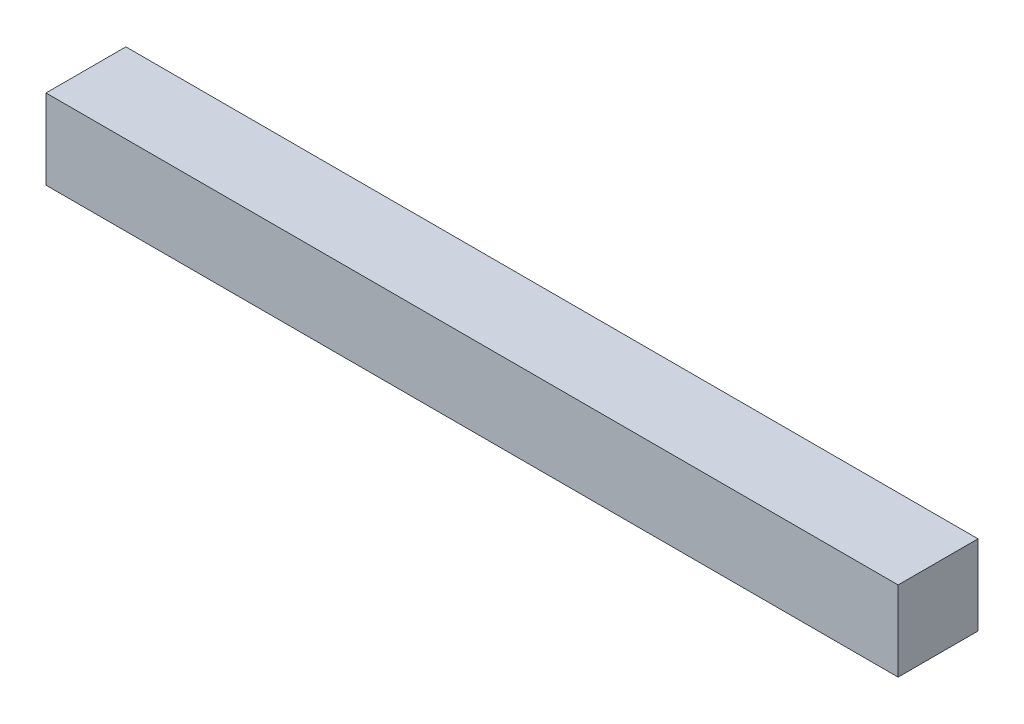
ISO-10303-21;
HEADER;
FILE_DESCRIPTION(('STEP AP214'),'2;1');
FILE_NAME('part.step','',(''),(''),'','','');
FILE_SCHEMA(('AUTOMOTIVE_DESIGN { 1 0 10303 214 1 1 1 1 }'));
ENDSEC;
DATA;
#1=APPLICATION_CONTEXT('core data for automotive mechanical design processes');
#2=APPLICATION_PROTOCOL_DEFINITION('international standard','automotive_design',2000,#1);
#3=PRODUCT_CONTEXT('',#1,'mechanical');
#4=PRODUCT('Part','Part','',(#3));
#5=PRODUCT_RELATED_PRODUCT_CATEGORY('part','',(#4));
#6=PRODUCT_DEFINITION_FORMATION('','',#4);
#7=PRODUCT_DEFINITION_CONTEXT('part definition',#1,'design');
#8=PRODUCT_DEFINITION('design','',#6,#7);
#9=PRODUCT_DEFINITION_SHAPE('','',#8);
#10=(LENGTH_UNIT() NAMED_UNIT(*) SI_UNIT(.MILLI.,.METRE.));
#11=(NAMED_UNIT(*) PLANE_ANGLE_UNIT() SI_UNIT($,.RADIAN.));
#12=(NAMED_UNIT(*) SI_UNIT($,.STERADIAN.) SOLID_ANGLE_UNIT());
#13=UNCERTAINTY_MEASURE_WITH_UNIT(LENGTH_MEASURE(1.E-05),#10,'distance_accuracy_value','');
#14=(GEOMETRIC_REPRESENTATION_CONTEXT(3) GLOBAL_UNCERTAINTY_ASSIGNED_CONTEXT((#13)) GLOBAL_UNIT_ASSIGNED_CONTEXT((#10,
#11,#12)) REPRESENTATION_CONTEXT('',''));
#15=CARTESIAN_POINT('',(0.,0.,0.));
#16=DIRECTION('',(0.,0.,1.));
#17=DIRECTION('',(1.,0.,0.));
#18=AXIS2_PLACEMENT_3D('',#15,#16,#17);
#19=CARTESIAN_POINT('',(-203.2,19.05,38.1));
#20=DIRECTION('',(1.,0.,0.));
#21=DIRECTION('',(0.,0.,-1.));
#22=AXIS2_PLACEMENT_3D('',#19,#20,#21);
#23=PLANE('',#22);
#24=DIRECTION('',(0.,-1.,0.));
#25=VECTOR('',#24,1.);
#26=CARTESIAN_POINT('',(-203.2,19.05,0.));
#27=LINE('',#26,#25);
#28=CARTESIAN_POINT('',(-203.2,19.05,0.));
#29=VERTEX_POINT('',#28);
#30=CARTESIAN_POINT('',(-203.2,-19.05,0.));
#31=VERTEX_POINT('',#30);
#32=EDGE_CURVE('E95',#29,#31,#27,.T.);
#33=ORIENTED_EDGE('',*,*,#32,.T.);
#34=DIRECTION('',(0.,0.,-1.));
#35=VECTOR('',#34,1.);
#36=CARTESIAN_POINT('',(-203.2,-19.05,38.1));
#37=LINE('',#36,#35);
#38=CARTESIAN_POINT('',(-203.2,-19.05,38.1));
#39=VERTEX_POINT('',#38);
#40=EDGE_CURVE('E11',#39,#31,#37,.T.);
#41=ORIENTED_EDGE('',*,*,#40,.F.);
#42=DIRECTION('',(0.,-1.,0.));
#43=VECTOR('',#42,1.);
#44=CARTESIAN_POINT('',(-203.2,19.05,38.1));
#45=LINE('',#44,#43);
#46=CARTESIAN_POINT('',(-203.2,19.05,38.1));
#47=VERTEX_POINT('',#46);
#48=EDGE_CURVE('E83',#47,#39,#45,.T.);
#49=ORIENTED_EDGE('',*,*,#48,.F.);
#50=DIRECTION('',(0.,0.,-1.));
#51=VECTOR('',#50,1.);
#52=CARTESIAN_POINT('',(-203.2,19.05,38.1));
#53=LINE('',#52,#51);
#54=EDGE_CURVE('E91',#47,#29,#53,.T.);
#55=ORIENTED_EDGE('',*,*,#54,.T.);
#56=EDGE_LOOP('',(#33,#41,#49,#55));
#57=FACE_BOUND('',#56,.T.);
#58=ADVANCED_FACE('F32',(#57),#23,.F.);
#59=CARTESIAN_POINT('',(-203.2,-19.05,38.1));
#60=DIRECTION('',(0.,1.,0.));
#61=DIRECTION('',(-1.,0.,0.));
#62=AXIS2_PLACEMENT_3D('',#59,#60,#61);
#63=PLANE('',#62);
#64=DIRECTION('',(1.,0.,0.));
#65=VECTOR('',#64,1.);
#66=CARTESIAN_POINT('',(-203.2,-19.05,0.));
#67=LINE('',#66,#65);
#68=CARTESIAN_POINT('',(203.2,-19.05,0.));
#69=VERTEX_POINT('',#68);
#70=EDGE_CURVE('E87',#31,#69,#67,.T.);
#71=ORIENTED_EDGE('',*,*,#70,.T.);
#72=DIRECTION('',(0.,0.,-1.));
#73=VECTOR('',#72,1.);
#74=CARTESIAN_POINT('',(203.2,-19.05,38.1));
#75=LINE('',#74,#73);
#76=CARTESIAN_POINT('',(203.2,-19.05,38.1));
#77=VERTEX_POINT('',#76);
#78=EDGE_CURVE('E40',#77,#69,#75,.T.);
#79=ORIENTED_EDGE('',*,*,#78,.F.);
#80=DIRECTION('',(1.,0.,0.));
#81=VECTOR('',#80,1.);
#82=CARTESIAN_POINT('',(-203.2,-19.05,38.1));
#83=LINE('',#82,#81);
#84=EDGE_CURVE('E78',#39,#77,#83,.T.);
#85=ORIENTED_EDGE('',*,*,#84,.F.);
#86=ORIENTED_EDGE('',*,*,#40,.T.);
#87=EDGE_LOOP('',(#71,#79,#85,#86));
#88=FACE_BOUND('',#87,.T.);
#89=ADVANCED_FACE('F86',(#88),#63,.F.);
#90=CARTESIAN_POINT('',(203.2,19.05,38.1));
#91=DIRECTION('',(-1.,0.,0.));
#92=DIRECTION('',(0.,0.,1.));
#93=AXIS2_PLACEMENT_3D('',#90,#91,#92);
#94=PLANE('',#93);
#95=DIRECTION('',(0.,1.,0.));
#96=VECTOR('',#95,1.);
#97=CARTESIAN_POINT('',(203.2,19.05,0.));
#98=LINE('',#97,#96);
#99=CARTESIAN_POINT('',(203.2,19.05,0.));
#100=VERTEX_POINT('',#99);
#101=EDGE_CURVE('E65',#69,#100,#98,.T.);
#102=ORIENTED_EDGE('',*,*,#101,.T.);
#103=DIRECTION('',(0.,0.,-1.));
#104=VECTOR('',#103,1.);
#105=CARTESIAN_POINT('',(203.2,19.05,38.1));
#106=LINE('',#105,#104);
#107=CARTESIAN_POINT('',(203.2,19.05,38.1));
#108=VERTEX_POINT('',#107);
#109=EDGE_CURVE('E88',#108,#100,#106,.T.);
#110=ORIENTED_EDGE('',*,*,#109,.F.);
#111=DIRECTION('',(0.,1.,0.));
#112=VECTOR('',#111,1.);
#113=CARTESIAN_POINT('',(203.2,19.05,38.1));
#114=LINE('',#113,#112);
#115=EDGE_CURVE('E81',#77,#108,#114,.T.);
#116=ORIENTED_EDGE('',*,*,#115,.F.);
#117=ORIENTED_EDGE('',*,*,#78,.T.);
#118=EDGE_LOOP('',(#102,#110,#116,#117));
#119=FACE_BOUND('',#118,.T.);
#120=ADVANCED_FACE('F89',(#119),#94,.F.);
#121=CARTESIAN_POINT('',(-203.2,19.05,38.1));
#122=DIRECTION('',(0.,-1.,0.));
#123=DIRECTION('',(1.,0.,0.));
#124=AXIS2_PLACEMENT_3D('',#121,#122,#123);
#125=PLANE('',#124);
#126=DIRECTION('',(-1.,0.,0.));
#127=VECTOR('',#126,1.);
#128=CARTESIAN_POINT('',(-203.2,19.05,0.));
#129=LINE('',#128,#127);
#130=EDGE_CURVE('E71',#100,#29,#129,.T.);
#131=ORIENTED_EDGE('',*,*,#130,.T.);
#132=ORIENTED_EDGE('',*,*,#54,.F.);
#133=DIRECTION('',(-1.,0.,0.));
#134=VECTOR('',#133,1.);
#135=CARTESIAN_POINT('',(-203.2,19.05,38.1));
#136=LINE('',#135,#134);
#137=EDGE_CURVE('E48',#108,#47,#136,.T.);
#138=ORIENTED_EDGE('',*,*,#137,.F.);
#139=ORIENTED_EDGE('',*,*,#109,.T.);
#140=EDGE_LOOP('',(#131,#132,#138,#139));
#141=FACE_BOUND('',#140,.T.);
#142=ADVANCED_FACE('F102',(#141),#125,.F.);
#143=CARTESIAN_POINT('',(0.,0.,38.1));
#144=DIRECTION('',(0.,0.,1.));
#145=DIRECTION('',(1.,0.,0.));
#146=AXIS2_PLACEMENT_3D('',#143,#144,#145);
#147=PLANE('',#146);
#148=ORIENTED_EDGE('',*,*,#48,.T.);
#149=ORIENTED_EDGE('',*,*,#84,.T.);
#150=ORIENTED_EDGE('',*,*,#115,.T.);
#151=ORIENTED_EDGE('',*,*,#137,.T.);
#152=EDGE_LOOP('',(#148,#149,#150,#151));
#153=FACE_BOUND('',#152,.T.);
#154=ADVANCED_FACE('F79',(#153),#147,.T.);
#155=CARTESIAN_POINT('',(0.,0.,0.));
#156=DIRECTION('',(0.,0.,1.));
#157=DIRECTION('',(1.,0.,0.));
#158=AXIS2_PLACEMENT_3D('',#155,#156,#157);
#159=PLANE('',#158);
#160=ORIENTED_EDGE('',*,*,#32,.F.);
#161=ORIENTED_EDGE('',*,*,#130,.F.);
#162=ORIENTED_EDGE('',*,*,#101,.F.);
#163=ORIENTED_EDGE('',*,*,#70,.F.);
#164=EDGE_LOOP('',(#160,#161,#162,#163));
#165=FACE_BOUND('',#164,.T.);
#166=ADVANCED_FACE('F105',(#165),#159,.F.);
#167=CLOSED_SHELL('',(#58,#89,#120,#142,#154,#166));
#168=MANIFOLD_SOLID_BREP('B2',#167);
#169=ADVANCED_BREP_SHAPE_REPRESENTATION('',(#18,#168),#14);
#170=SHAPE_DEFINITION_REPRESENTATION(#9,#169);
ENDSEC;
END-ISO-10303-21;
